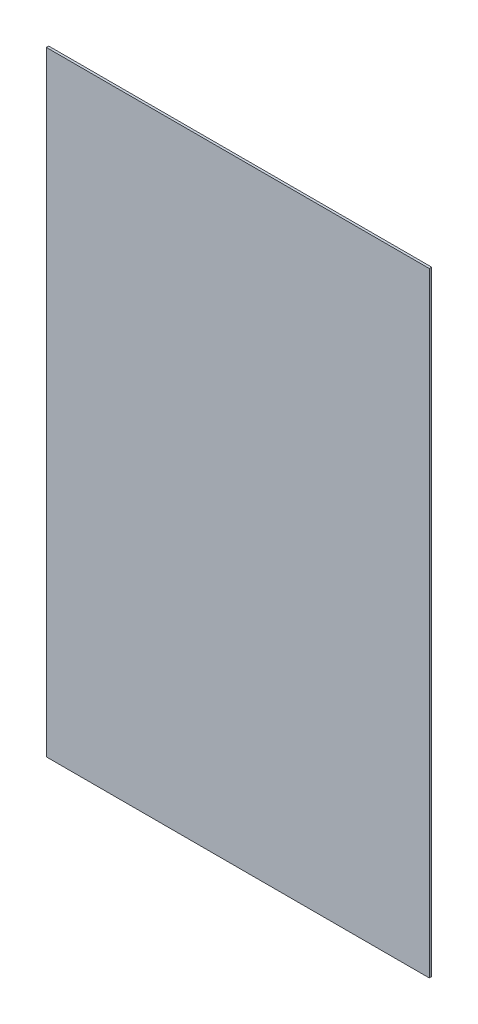
ISO-10303-21;
HEADER;
FILE_DESCRIPTION(('STEP AP214'),'2;1');
FILE_NAME('part.step','',(''),(''),'','','');
FILE_SCHEMA(('AUTOMOTIVE_DESIGN { 1 0 10303 214 1 1 1 1 }'));
ENDSEC;
DATA;
#1=APPLICATION_CONTEXT('core data for automotive mechanical design processes');
#2=APPLICATION_PROTOCOL_DEFINITION('international standard','automotive_design',2000,#1);
#3=PRODUCT_CONTEXT('',#1,'mechanical');
#4=PRODUCT('Part','Part','',(#3));
#5=PRODUCT_RELATED_PRODUCT_CATEGORY('part','',(#4));
#6=PRODUCT_DEFINITION_FORMATION('','',#4);
#7=PRODUCT_DEFINITION_CONTEXT('part definition',#1,'design');
#8=PRODUCT_DEFINITION('design','',#6,#7);
#9=PRODUCT_DEFINITION_SHAPE('','',#8);
#10=(LENGTH_UNIT() NAMED_UNIT(*) SI_UNIT(.MILLI.,.METRE.));
#11=(NAMED_UNIT(*) PLANE_ANGLE_UNIT() SI_UNIT($,.RADIAN.));
#12=(NAMED_UNIT(*) SI_UNIT($,.STERADIAN.) SOLID_ANGLE_UNIT());
#13=UNCERTAINTY_MEASURE_WITH_UNIT(LENGTH_MEASURE(1.E-05),#10,'distance_accuracy_value','');
#14=(GEOMETRIC_REPRESENTATION_CONTEXT(3) GLOBAL_UNCERTAINTY_ASSIGNED_CONTEXT((#13)) GLOBAL_UNIT_ASSIGNED_CONTEXT((#10,
#11,#12)) REPRESENTATION_CONTEXT('',''));
#15=CARTESIAN_POINT('',(0.,0.,0.));
#16=DIRECTION('',(0.,0.,1.));
#17=DIRECTION('',(1.,0.,0.));
#18=AXIS2_PLACEMENT_3D('',#15,#16,#17);
#19=CARTESIAN_POINT('',(-413.368421052632,286.385964912281,3.));
#20=DIRECTION('',(1.,0.,0.));
#21=DIRECTION('',(0.,1.,0.));
#22=AXIS2_PLACEMENT_3D('',#19,#20,#21);
#23=PLANE('',#22);
#24=DIRECTION('',(0.,-1.,0.));
#25=VECTOR('',#24,1.);
#26=CARTESIAN_POINT('',(-413.368421052632,286.385964912281,0.));
#27=LINE('',#26,#25);
#28=CARTESIAN_POINT('',(-413.368421052632,286.385964912281,0.));
#29=VERTEX_POINT('',#28);
#30=CARTESIAN_POINT('',(-413.368421052632,-483.614035087719,0.));
#31=VERTEX_POINT('',#30);
#32=EDGE_CURVE('E101',#29,#31,#27,.T.);
#33=ORIENTED_EDGE('',*,*,#32,.T.);
#34=DIRECTION('',(0.,0.,-1.));
#35=VECTOR('',#34,1.);
#36=CARTESIAN_POINT('',(-413.368421052632,-483.614035087719,3.));
#37=LINE('',#36,#35);
#38=CARTESIAN_POINT('',(-413.368421052632,-483.614035087719,3.));
#39=VERTEX_POINT('',#38);
#40=EDGE_CURVE('E11',#39,#31,#37,.T.);
#41=ORIENTED_EDGE('',*,*,#40,.F.);
#42=DIRECTION('',(0.,-1.,0.));
#43=VECTOR('',#42,1.);
#44=CARTESIAN_POINT('',(-413.368421052632,286.385964912281,3.));
#45=LINE('',#44,#43);
#46=CARTESIAN_POINT('',(-413.368421052632,286.385964912281,3.));
#47=VERTEX_POINT('',#46);
#48=EDGE_CURVE('E89',#47,#39,#45,.T.);
#49=ORIENTED_EDGE('',*,*,#48,.F.);
#50=DIRECTION('',(0.,0.,-1.));
#51=VECTOR('',#50,1.);
#52=CARTESIAN_POINT('',(-413.368421052632,286.385964912281,3.));
#53=LINE('',#52,#51);
#54=EDGE_CURVE('E97',#47,#29,#53,.T.);
#55=ORIENTED_EDGE('',*,*,#54,.T.);
#56=EDGE_LOOP('',(#33,#41,#49,#55));
#57=FACE_BOUND('',#56,.T.);
#58=ADVANCED_FACE('F38',(#57),#23,.F.);
#59=CARTESIAN_POINT('',(-413.368421052632,-483.614035087719,3.));
#60=DIRECTION('',(0.,1.,0.));
#61=DIRECTION('',(0.,0.,1.));
#62=AXIS2_PLACEMENT_3D('',#59,#60,#61);
#63=PLANE('',#62);
#64=DIRECTION('',(1.,0.,0.));
#65=VECTOR('',#64,1.);
#66=CARTESIAN_POINT('',(-413.368421052632,-483.614035087719,0.));
#67=LINE('',#66,#65);
#68=CARTESIAN_POINT('',(66.6315789473682,-483.614035087719,0.));
#69=VERTEX_POINT('',#68);
#70=EDGE_CURVE('E93',#31,#69,#67,.T.);
#71=ORIENTED_EDGE('',*,*,#70,.T.);
#72=DIRECTION('',(0.,0.,-1.));
#73=VECTOR('',#72,1.);
#74=CARTESIAN_POINT('',(66.6315789473682,-483.614035087719,3.));
#75=LINE('',#74,#73);
#76=CARTESIAN_POINT('',(66.6315789473682,-483.614035087719,3.));
#77=VERTEX_POINT('',#76);
#78=EDGE_CURVE('E46',#77,#69,#75,.T.);
#79=ORIENTED_EDGE('',*,*,#78,.F.);
#80=DIRECTION('',(1.,0.,0.));
#81=VECTOR('',#80,1.);
#82=CARTESIAN_POINT('',(-413.368421052632,-483.614035087719,3.));
#83=LINE('',#82,#81);
#84=EDGE_CURVE('E84',#39,#77,#83,.T.);
#85=ORIENTED_EDGE('',*,*,#84,.F.);
#86=ORIENTED_EDGE('',*,*,#40,.T.);
#87=EDGE_LOOP('',(#71,#79,#85,#86));
#88=FACE_BOUND('',#87,.T.);
#89=ADVANCED_FACE('F92',(#88),#63,.F.);
#90=CARTESIAN_POINT('',(66.6315789473681,286.385964912281,3.));
#91=DIRECTION('',(-1.,0.,0.));
#92=DIRECTION('',(0.,-1.,0.));
#93=AXIS2_PLACEMENT_3D('',#90,#91,#92);
#94=PLANE('',#93);
#95=DIRECTION('',(0.,1.,0.));
#96=VECTOR('',#95,1.);
#97=CARTESIAN_POINT('',(66.6315789473681,286.385964912281,0.));
#98=LINE('',#97,#96);
#99=CARTESIAN_POINT('',(66.6315789473681,286.385964912281,0.));
#100=VERTEX_POINT('',#99);
#101=EDGE_CURVE('E71',#69,#100,#98,.T.);
#102=ORIENTED_EDGE('',*,*,#101,.T.);
#103=DIRECTION('',(0.,0.,-1.));
#104=VECTOR('',#103,1.);
#105=CARTESIAN_POINT('',(66.6315789473681,286.385964912281,3.));
#106=LINE('',#105,#104);
#107=CARTESIAN_POINT('',(66.6315789473681,286.385964912281,3.));
#108=VERTEX_POINT('',#107);
#109=EDGE_CURVE('E94',#108,#100,#106,.T.);
#110=ORIENTED_EDGE('',*,*,#109,.F.);
#111=DIRECTION('',(0.,1.,0.));
#112=VECTOR('',#111,1.);
#113=CARTESIAN_POINT('',(66.6315789473681,286.385964912281,3.));
#114=LINE('',#113,#112);
#115=EDGE_CURVE('E87',#77,#108,#114,.T.);
#116=ORIENTED_EDGE('',*,*,#115,.F.);
#117=ORIENTED_EDGE('',*,*,#78,.T.);
#118=EDGE_LOOP('',(#102,#110,#116,#117));
#119=FACE_BOUND('',#118,.T.);
#120=ADVANCED_FACE('F95',(#119),#94,.F.);
#121=CARTESIAN_POINT('',(-413.368421052632,286.385964912281,3.));
#122=DIRECTION('',(0.,-1.,0.));
#123=DIRECTION('',(0.,0.,-1.));
#124=AXIS2_PLACEMENT_3D('',#121,#122,#123);
#125=PLANE('',#124);
#126=DIRECTION('',(-1.,0.,0.));
#127=VECTOR('',#126,1.);
#128=CARTESIAN_POINT('',(-413.368421052632,286.385964912281,0.));
#129=LINE('',#128,#127);
#130=EDGE_CURVE('E77',#100,#29,#129,.T.);
#131=ORIENTED_EDGE('',*,*,#130,.T.);
#132=ORIENTED_EDGE('',*,*,#54,.F.);
#133=DIRECTION('',(-1.,0.,0.));
#134=VECTOR('',#133,1.);
#135=CARTESIAN_POINT('',(-413.368421052632,286.385964912281,3.));
#136=LINE('',#135,#134);
#137=EDGE_CURVE('E54',#108,#47,#136,.T.);
#138=ORIENTED_EDGE('',*,*,#137,.F.);
#139=ORIENTED_EDGE('',*,*,#109,.T.);
#140=EDGE_LOOP('',(#131,#132,#138,#139));
#141=FACE_BOUND('',#140,.T.);
#142=ADVANCED_FACE('F108',(#141),#125,.F.);
#143=CARTESIAN_POINT('',(0.,0.,3.));
#144=DIRECTION('',(0.,0.,1.));
#145=DIRECTION('',(1.,0.,0.));
#146=AXIS2_PLACEMENT_3D('',#143,#144,#145);
#147=PLANE('',#146);
#148=ORIENTED_EDGE('',*,*,#48,.T.);
#149=ORIENTED_EDGE('',*,*,#84,.T.);
#150=ORIENTED_EDGE('',*,*,#115,.T.);
#151=ORIENTED_EDGE('',*,*,#137,.T.);
#152=EDGE_LOOP('',(#148,#149,#150,#151));
#153=FACE_BOUND('',#152,.T.);
#154=ADVANCED_FACE('F85',(#153),#147,.T.);
#155=CARTESIAN_POINT('',(0.,0.,0.));
#156=DIRECTION('',(0.,0.,1.));
#157=DIRECTION('',(1.,0.,0.));
#158=AXIS2_PLACEMENT_3D('',#155,#156,#157);
#159=PLANE('',#158);
#160=ORIENTED_EDGE('',*,*,#32,.F.);
#161=ORIENTED_EDGE('',*,*,#130,.F.);
#162=ORIENTED_EDGE('',*,*,#101,.F.);
#163=ORIENTED_EDGE('',*,*,#70,.F.);
#164=EDGE_LOOP('',(#160,#161,#162,#163));
#165=FACE_BOUND('',#164,.T.);
#166=ADVANCED_FACE('F111',(#165),#159,.F.);
#167=CLOSED_SHELL('',(#58,#89,#120,#142,#154,#166));
#168=MANIFOLD_SOLID_BREP('B2',#167);
#169=ADVANCED_BREP_SHAPE_REPRESENTATION('',(#18,#168),#14);
#170=SHAPE_DEFINITION_REPRESENTATION(#9,#169);
ENDSEC;
END-ISO-10303-21;
